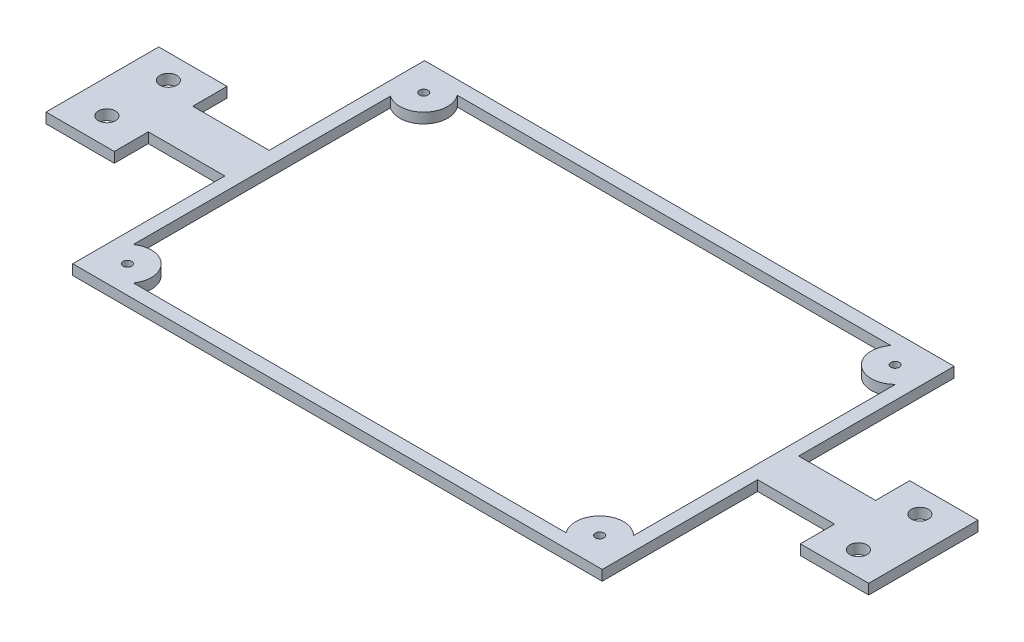
ISO-10303-21;
HEADER;
FILE_DESCRIPTION(('STEP AP214'),'2;1');
FILE_NAME('part.step','',(''),(''),'','','');
FILE_SCHEMA(('AUTOMOTIVE_DESIGN { 1 0 10303 214 1 1 1 1 }'));
ENDSEC;
DATA;
#1=APPLICATION_CONTEXT('core data for automotive mechanical design processes');
#2=APPLICATION_PROTOCOL_DEFINITION('international standard','automotive_design',2000,#1);
#3=PRODUCT_CONTEXT('',#1,'mechanical');
#4=PRODUCT('Part','Part','',(#3));
#5=PRODUCT_RELATED_PRODUCT_CATEGORY('part','',(#4));
#6=PRODUCT_DEFINITION_FORMATION('','',#4);
#7=PRODUCT_DEFINITION_CONTEXT('part definition',#1,'design');
#8=PRODUCT_DEFINITION('design','',#6,#7);
#9=PRODUCT_DEFINITION_SHAPE('','',#8);
#10=(LENGTH_UNIT() NAMED_UNIT(*) SI_UNIT(.MILLI.,.METRE.));
#11=(NAMED_UNIT(*) PLANE_ANGLE_UNIT() SI_UNIT($,.RADIAN.));
#12=(NAMED_UNIT(*) SI_UNIT($,.STERADIAN.) SOLID_ANGLE_UNIT());
#13=UNCERTAINTY_MEASURE_WITH_UNIT(LENGTH_MEASURE(1.E-05),#10,'distance_accuracy_value','');
#14=(GEOMETRIC_REPRESENTATION_CONTEXT(3) GLOBAL_UNCERTAINTY_ASSIGNED_CONTEXT((#13)) GLOBAL_UNIT_ASSIGNED_CONTEXT((#10,
#11,#12)) REPRESENTATION_CONTEXT('',''));
#15=CARTESIAN_POINT('',(0.,0.,0.));
#16=DIRECTION('',(0.,0.,1.));
#17=DIRECTION('',(1.,0.,0.));
#18=AXIS2_PLACEMENT_3D('',#15,#16,#17);
#19=CARTESIAN_POINT('',(155.,3.,0.));
#20=DIRECTION('',(-1.,0.,0.));
#21=DIRECTION('',(0.,0.,1.));
#22=AXIS2_PLACEMENT_3D('',#19,#20,#21);
#23=PLANE('',#22);
#24=DIRECTION('',(0.,1.,0.));
#25=VECTOR('',#24,1.);
#26=CARTESIAN_POINT('',(155.,3.,-57.5));
#27=LINE('',#26,#25);
#28=CARTESIAN_POINT('',(155.,0.,-57.5));
#29=VERTEX_POINT('',#28);
#30=CARTESIAN_POINT('',(155.,3.,-57.5));
#31=VERTEX_POINT('',#30);
#32=EDGE_CURVE('E378',#29,#31,#27,.T.);
#33=ORIENTED_EDGE('',*,*,#32,.F.);
#34=DIRECTION('',(0.,0.,-1.));
#35=VECTOR('',#34,1.);
#36=CARTESIAN_POINT('',(155.,0.,0.));
#37=LINE('',#36,#35);
#38=CARTESIAN_POINT('',(155.,0.,-103.));
#39=VERTEX_POINT('',#38);
#40=EDGE_CURVE('E453',#29,#39,#37,.T.);
#41=ORIENTED_EDGE('',*,*,#40,.T.);
#42=DIRECTION('',(0.,-1.,0.));
#43=VECTOR('',#42,1.);
#44=CARTESIAN_POINT('',(155.,3.,-103.));
#45=LINE('',#44,#43);
#46=CARTESIAN_POINT('',(155.,3.,-103.));
#47=VERTEX_POINT('',#46);
#48=EDGE_CURVE('E460',#47,#39,#45,.T.);
#49=ORIENTED_EDGE('',*,*,#48,.F.);
#50=DIRECTION('',(0.,0.,-1.));
#51=VECTOR('',#50,1.);
#52=CARTESIAN_POINT('',(155.,3.,0.));
#53=LINE('',#52,#51);
#54=EDGE_CURVE('E441',#31,#47,#53,.T.);
#55=ORIENTED_EDGE('',*,*,#54,.F.);
#56=EDGE_LOOP('',(#33,#41,#49,#55));
#57=FACE_BOUND('',#56,.T.);
#58=ADVANCED_FACE('F32',(#57),#23,.F.);
#59=DIRECTION('',(0.,-1.,0.));
#60=VECTOR('',#59,1.);
#61=CARTESIAN_POINT('',(155.,3.,-45.5));
#62=LINE('',#61,#60);
#63=CARTESIAN_POINT('',(155.,3.,-45.5));
#64=VERTEX_POINT('',#63);
#65=CARTESIAN_POINT('',(155.,0.,-45.5));
#66=VERTEX_POINT('',#65);
#67=EDGE_CURVE('E389',#64,#66,#62,.T.);
#68=ORIENTED_EDGE('',*,*,#67,.F.);
#69=CARTESIAN_POINT('',(155.,3.,0.));
#70=VERTEX_POINT('',#69);
#71=EDGE_CURVE('E442',#70,#64,#53,.T.);
#72=ORIENTED_EDGE('',*,*,#71,.F.);
#73=DIRECTION('',(0.,-1.,0.));
#74=VECTOR('',#73,1.);
#75=CARTESIAN_POINT('',(155.,3.,0.));
#76=LINE('',#75,#74);
#77=CARTESIAN_POINT('',(155.,0.,0.));
#78=VERTEX_POINT('',#77);
#79=EDGE_CURVE('E463',#70,#78,#76,.T.);
#80=ORIENTED_EDGE('',*,*,#79,.T.);
#81=EDGE_CURVE('E454',#78,#66,#37,.T.);
#82=ORIENTED_EDGE('',*,*,#81,.T.);
#83=EDGE_LOOP('',(#68,#72,#80,#82));
#84=FACE_BOUND('',#83,.T.);
#85=ADVANCED_FACE('F510',(#84),#23,.F.);
#86=CARTESIAN_POINT('',(0.,3.,0.));
#87=DIRECTION('',(1.,0.,0.));
#88=DIRECTION('',(0.,0.,-1.));
#89=AXIS2_PLACEMENT_3D('',#86,#87,#88);
#90=PLANE('',#89);
#91=DIRECTION('',(0.,-1.,0.));
#92=VECTOR('',#91,1.);
#93=CARTESIAN_POINT('',(0.,0.,-57.5));
#94=LINE('',#93,#92);
#95=CARTESIAN_POINT('',(0.,3.,-57.5));
#96=VERTEX_POINT('',#95);
#97=CARTESIAN_POINT('',(0.,0.,-57.5));
#98=VERTEX_POINT('',#97);
#99=EDGE_CURVE('E408',#96,#98,#94,.T.);
#100=ORIENTED_EDGE('',*,*,#99,.F.);
#101=DIRECTION('',(0.,0.,1.));
#102=VECTOR('',#101,1.);
#103=CARTESIAN_POINT('',(0.,3.,0.));
#104=LINE('',#103,#102);
#105=CARTESIAN_POINT('',(0.,3.,-103.));
#106=VERTEX_POINT('',#105);
#107=EDGE_CURVE('E435',#106,#96,#104,.T.);
#108=ORIENTED_EDGE('',*,*,#107,.F.);
#109=DIRECTION('',(0.,-1.,0.));
#110=VECTOR('',#109,1.);
#111=CARTESIAN_POINT('',(0.,3.,-103.));
#112=LINE('',#111,#110);
#113=CARTESIAN_POINT('',(0.,0.,-103.));
#114=VERTEX_POINT('',#113);
#115=EDGE_CURVE('E447',#106,#114,#112,.T.);
#116=ORIENTED_EDGE('',*,*,#115,.T.);
#117=DIRECTION('',(0.,0.,1.));
#118=VECTOR('',#117,1.);
#119=CARTESIAN_POINT('',(0.,0.,0.));
#120=LINE('',#119,#118);
#121=EDGE_CURVE('E448',#114,#98,#120,.T.);
#122=ORIENTED_EDGE('',*,*,#121,.T.);
#123=EDGE_LOOP('',(#100,#108,#116,#122));
#124=FACE_BOUND('',#123,.T.);
#125=ADVANCED_FACE('F34',(#124),#90,.F.);
#126=DIRECTION('',(0.,1.,0.));
#127=VECTOR('',#126,1.);
#128=CARTESIAN_POINT('',(0.,0.,-44.5));
#129=LINE('',#128,#127);
#130=CARTESIAN_POINT('',(0.,0.,-44.5));
#131=VERTEX_POINT('',#130);
#132=CARTESIAN_POINT('',(0.,3.,-44.5));
#133=VERTEX_POINT('',#132);
#134=EDGE_CURVE('E411',#131,#133,#129,.T.);
#135=ORIENTED_EDGE('',*,*,#134,.F.);
#136=CARTESIAN_POINT('',(0.,0.,0.));
#137=VERTEX_POINT('',#136);
#138=EDGE_CURVE('E227',#131,#137,#120,.T.);
#139=ORIENTED_EDGE('',*,*,#138,.T.);
#140=DIRECTION('',(0.,-1.,0.));
#141=VECTOR('',#140,1.);
#142=CARTESIAN_POINT('',(0.,3.,0.));
#143=LINE('',#142,#141);
#144=CARTESIAN_POINT('',(0.,3.,0.));
#145=VERTEX_POINT('',#144);
#146=EDGE_CURVE('E466',#145,#137,#143,.T.);
#147=ORIENTED_EDGE('',*,*,#146,.F.);
#148=EDGE_CURVE('E439',#133,#145,#104,.T.);
#149=ORIENTED_EDGE('',*,*,#148,.F.);
#150=EDGE_LOOP('',(#135,#139,#147,#149));
#151=FACE_BOUND('',#150,.T.);
#152=ADVANCED_FACE('F547',(#151),#90,.F.);
#153=CARTESIAN_POINT('',(0.,3.,0.));
#154=DIRECTION('',(0.,-1.,0.));
#155=DIRECTION('',(0.,0.,-1.));
#156=AXIS2_PLACEMENT_3D('',#153,#154,#155);
#157=PLANE('',#156);
#158=DIRECTION('',(1.,0.,0.));
#159=VECTOR('',#158,1.);
#160=CARTESIAN_POINT('',(-22.5,3.,-57.5));
#161=LINE('',#160,#159);
#162=CARTESIAN_POINT('',(-22.3784310728865,3.,-57.5));
#163=VERTEX_POINT('',#162);
#164=EDGE_CURVE('E414',#163,#96,#161,.T.);
#165=ORIENTED_EDGE('',*,*,#164,.F.);
#166=DIRECTION('',(0.,0.,-1.));
#167=VECTOR('',#166,1.);
#168=CARTESIAN_POINT('',(-22.3784310728865,3.,-67.5503902211051));
#169=LINE('',#168,#167);
#170=CARTESIAN_POINT('',(-22.3784310728865,3.,-67.5503902211051));
#171=VERTEX_POINT('',#170);
#172=EDGE_CURVE('E298',#163,#171,#169,.T.);
#173=ORIENTED_EDGE('',*,*,#172,.T.);
#174=DIRECTION('',(-1.,0.,0.));
#175=VECTOR('',#174,1.);
#176=CARTESIAN_POINT('',(-22.3784310728865,3.,-67.5503902211051));
#177=LINE('',#176,#175);
#178=CARTESIAN_POINT('',(-42.3784310728865,3.,-67.5503902211051));
#179=VERTEX_POINT('',#178);
#180=EDGE_CURVE('E318',#171,#179,#177,.T.);
#181=ORIENTED_EDGE('',*,*,#180,.T.);
#182=DIRECTION('',(0.,0.,1.));
#183=VECTOR('',#182,1.);
#184=CARTESIAN_POINT('',(-42.3784310728865,3.,-67.5503902211051));
#185=LINE('',#184,#183);
#186=CARTESIAN_POINT('',(-42.3784310728865,3.,-34.5503902211051));
#187=VERTEX_POINT('',#186);
#188=EDGE_CURVE('E321',#179,#187,#185,.T.);
#189=ORIENTED_EDGE('',*,*,#188,.T.);
#190=DIRECTION('',(1.,0.,0.));
#191=VECTOR('',#190,1.);
#192=CARTESIAN_POINT('',(-22.3784310728865,3.,-34.5503902211051));
#193=LINE('',#192,#191);
#194=CARTESIAN_POINT('',(-22.3784310728865,3.,-34.5503902211051));
#195=VERTEX_POINT('',#194);
#196=EDGE_CURVE('E324',#187,#195,#193,.T.);
#197=ORIENTED_EDGE('',*,*,#196,.T.);
#198=CARTESIAN_POINT('',(-22.3784310728865,3.,-44.5));
#199=VERTEX_POINT('',#198);
#200=EDGE_CURVE('E315',#195,#199,#169,.T.);
#201=ORIENTED_EDGE('',*,*,#200,.T.);
#202=DIRECTION('',(1.,0.,0.));
#203=VECTOR('',#202,1.);
#204=CARTESIAN_POINT('',(-22.5,3.,-44.5));
#205=LINE('',#204,#203);
#206=EDGE_CURVE('E416',#199,#133,#205,.T.);
#207=ORIENTED_EDGE('',*,*,#206,.T.);
#208=ORIENTED_EDGE('',*,*,#148,.T.);
#209=DIRECTION('',(1.,0.,0.));
#210=VECTOR('',#209,1.);
#211=CARTESIAN_POINT('',(0.,3.,0.));
#212=LINE('',#211,#210);
#213=EDGE_CURVE('E438',#145,#70,#212,.T.);
#214=ORIENTED_EDGE('',*,*,#213,.T.);
#215=ORIENTED_EDGE('',*,*,#71,.T.);
#216=DIRECTION('',(-1.,0.,0.));
#217=VECTOR('',#216,1.);
#218=CARTESIAN_POINT('',(177.5,3.,-45.5));
#219=LINE('',#218,#217);
#220=CARTESIAN_POINT('',(177.5,3.,-45.5));
#221=VERTEX_POINT('',#220);
#222=EDGE_CURVE('E402',#221,#64,#219,.T.);
#223=ORIENTED_EDGE('',*,*,#222,.F.);
#224=DIRECTION('',(0.,0.,1.));
#225=VECTOR('',#224,1.);
#226=CARTESIAN_POINT('',(177.5,3.,-67.5));
#227=LINE('',#226,#225);
#228=CARTESIAN_POINT('',(177.5,3.,-35.5));
#229=VERTEX_POINT('',#228);
#230=EDGE_CURVE('E347',#221,#229,#227,.T.);
#231=ORIENTED_EDGE('',*,*,#230,.T.);
#232=DIRECTION('',(1.,0.,0.));
#233=VECTOR('',#232,1.);
#234=CARTESIAN_POINT('',(177.5,3.,-35.5));
#235=LINE('',#234,#233);
#236=CARTESIAN_POINT('',(197.5,3.,-35.5));
#237=VERTEX_POINT('',#236);
#238=EDGE_CURVE('E367',#229,#237,#235,.T.);
#239=ORIENTED_EDGE('',*,*,#238,.T.);
#240=DIRECTION('',(0.,0.,-1.));
#241=VECTOR('',#240,1.);
#242=CARTESIAN_POINT('',(197.5,3.,-67.5));
#243=LINE('',#242,#241);
#244=CARTESIAN_POINT('',(197.5,3.,-67.5));
#245=VERTEX_POINT('',#244);
#246=EDGE_CURVE('E370',#237,#245,#243,.T.);
#247=ORIENTED_EDGE('',*,*,#246,.T.);
#248=DIRECTION('',(-1.,0.,0.));
#249=VECTOR('',#248,1.);
#250=CARTESIAN_POINT('',(177.5,3.,-67.5));
#251=LINE('',#250,#249);
#252=CARTESIAN_POINT('',(177.5,3.,-67.5));
#253=VERTEX_POINT('',#252);
#254=EDGE_CURVE('E373',#245,#253,#251,.T.);
#255=ORIENTED_EDGE('',*,*,#254,.T.);
#256=CARTESIAN_POINT('',(177.5,3.,-57.5));
#257=VERTEX_POINT('',#256);
#258=EDGE_CURVE('E364',#253,#257,#227,.T.);
#259=ORIENTED_EDGE('',*,*,#258,.T.);
#260=DIRECTION('',(-1.,0.,0.));
#261=VECTOR('',#260,1.);
#262=CARTESIAN_POINT('',(177.5,3.,-57.5));
#263=LINE('',#262,#261);
#264=EDGE_CURVE('E405',#257,#31,#263,.T.);
#265=ORIENTED_EDGE('',*,*,#264,.T.);
#266=ORIENTED_EDGE('',*,*,#54,.T.);
#267=DIRECTION('',(-1.,0.,0.));
#268=VECTOR('',#267,1.);
#269=CARTESIAN_POINT('',(0.,3.,-103.));
#270=LINE('',#269,#268);
#271=EDGE_CURVE('E445',#47,#106,#270,.T.);
#272=ORIENTED_EDGE('',*,*,#271,.T.);
#273=ORIENTED_EDGE('',*,*,#107,.T.);
#274=EDGE_LOOP('',(#165,#173,#181,#189,#197,#201,#207,#208,#214,#215,#223,#231,#239,#247,#255,
#259,#265,#266,#272,#273));
#275=FACE_BOUND('',#274,.T.);
#276=DIRECTION('',(-1.,0.,0.));
#277=VECTOR('',#276,1.);
#278=CARTESIAN_POINT('',(4.,3.,-99.));
#279=LINE('',#278,#277);
#280=CARTESIAN_POINT('',(140.437851134678,3.,-99.));
#281=VERTEX_POINT('',#280);
#282=CARTESIAN_POINT('',(13.5621488653217,3.,-99.));
#283=VERTEX_POINT('',#282);
#284=EDGE_CURVE('E215',#281,#283,#279,.T.);
#285=ORIENTED_EDGE('',*,*,#284,.F.);
#286=CARTESIAN_POINT('',(146.,3.,-94.75));
#287=DIRECTION('',(0.,1.,0.));
#288=DIRECTION('',(0.,0.,1.));
#289=AXIS2_PLACEMENT_3D('',#286,#287,#288);
#290=CIRCLE('',#289,7.00000000000002);
#291=CARTESIAN_POINT('',(151.,3.,-89.8510205144336));
#292=VERTEX_POINT('',#291);
#293=EDGE_CURVE('E220',#281,#292,#290,.T.);
#294=ORIENTED_EDGE('',*,*,#293,.T.);
#295=DIRECTION('',(0.,0.,-1.));
#296=VECTOR('',#295,1.);
#297=CARTESIAN_POINT('',(151.,3.,-4.));
#298=LINE('',#297,#296);
#299=CARTESIAN_POINT('',(151.,3.,-13.1489794855664));
#300=VERTEX_POINT('',#299);
#301=EDGE_CURVE('E52',#300,#292,#298,.T.);
#302=ORIENTED_EDGE('',*,*,#301,.F.);
#303=CARTESIAN_POINT('',(146.,3.,-8.25));
#304=DIRECTION('',(0.,1.,0.));
#305=DIRECTION('',(0.,0.,1.));
#306=AXIS2_PLACEMENT_3D('',#303,#304,#305);
#307=CIRCLE('',#306,7.00000000000001);
#308=CARTESIAN_POINT('',(140.437851134678,3.,-4.));
#309=VERTEX_POINT('',#308);
#310=EDGE_CURVE('E262',#300,#309,#307,.T.);
#311=ORIENTED_EDGE('',*,*,#310,.T.);
#312=DIRECTION('',(1.,0.,0.));
#313=VECTOR('',#312,1.);
#314=CARTESIAN_POINT('',(4.,3.,-4.));
#315=LINE('',#314,#313);
#316=CARTESIAN_POINT('',(13.744562646538,3.,-4.));
#317=VERTEX_POINT('',#316);
#318=EDGE_CURVE('E425',#317,#309,#315,.T.);
#319=ORIENTED_EDGE('',*,*,#318,.F.);
#320=CARTESIAN_POINT('',(8.,3.,-8.));
#321=DIRECTION('',(0.,1.,0.));
#322=DIRECTION('',(0.,0.,1.));
#323=AXIS2_PLACEMENT_3D('',#320,#321,#322);
#324=CIRCLE('',#323,7.);
#325=CARTESIAN_POINT('',(4.,3.,-13.744562646538));
#326=VERTEX_POINT('',#325);
#327=EDGE_CURVE('E277',#317,#326,#324,.T.);
#328=ORIENTED_EDGE('',*,*,#327,.T.);
#329=DIRECTION('',(0.,0.,1.));
#330=VECTOR('',#329,1.);
#331=CARTESIAN_POINT('',(4.,3.,-4.));
#332=LINE('',#331,#330);
#333=CARTESIAN_POINT('',(4.,3.,-89.005437353462));
#334=VERTEX_POINT('',#333);
#335=EDGE_CURVE('E423',#334,#326,#332,.T.);
#336=ORIENTED_EDGE('',*,*,#335,.F.);
#337=CARTESIAN_POINT('',(8.,3.,-94.75));
#338=DIRECTION('',(0.,1.,0.));
#339=DIRECTION('',(0.,0.,1.));
#340=AXIS2_PLACEMENT_3D('',#337,#338,#339);
#341=CIRCLE('',#340,7.);
#342=EDGE_CURVE('E223',#334,#283,#341,.T.);
#343=ORIENTED_EDGE('',*,*,#342,.T.);
#344=EDGE_LOOP('',(#285,#294,#302,#311,#319,#328,#336,#343));
#345=FACE_BOUND('',#344,.T.);
#346=CARTESIAN_POINT('',(187.5,3.,-60.5));
#347=DIRECTION('',(0.,1.,0.));
#348=DIRECTION('',(0.,0.,1.));
#349=AXIS2_PLACEMENT_3D('',#346,#347,#348);
#350=CIRCLE('',#349,2.5);
#351=CARTESIAN_POINT('',(187.5,3.,-58.));
#352=VERTEX_POINT('',#351);
#353=EDGE_CURVE('E337',#352,#352,#350,.T.);
#354=ORIENTED_EDGE('',*,*,#353,.F.);
#355=EDGE_LOOP('',(#354));
#356=FACE_BOUND('',#355,.T.);
#357=CARTESIAN_POINT('',(187.5,3.,-42.5));
#358=DIRECTION('',(0.,1.,0.));
#359=DIRECTION('',(0.,0.,1.));
#360=AXIS2_PLACEMENT_3D('',#357,#358,#359);
#361=CIRCLE('',#360,2.5);
#362=CARTESIAN_POINT('',(187.5,3.,-40.));
#363=VERTEX_POINT('',#362);
#364=EDGE_CURVE('E341',#363,#363,#361,.T.);
#365=ORIENTED_EDGE('',*,*,#364,.F.);
#366=EDGE_LOOP('',(#365));
#367=FACE_BOUND('',#366,.T.);
#368=CARTESIAN_POINT('',(-32.5,3.,-60.5));
#369=DIRECTION('',(0.,1.,0.));
#370=DIRECTION('',(0.,0.,1.));
#371=AXIS2_PLACEMENT_3D('',#368,#369,#370);
#372=CIRCLE('',#371,2.5);
#373=CARTESIAN_POINT('',(-32.5,3.,-58.));
#374=VERTEX_POINT('',#373);
#375=EDGE_CURVE('E288',#374,#374,#372,.T.);
#376=ORIENTED_EDGE('',*,*,#375,.F.);
#377=EDGE_LOOP('',(#376));
#378=FACE_BOUND('',#377,.T.);
#379=CARTESIAN_POINT('',(-32.5,3.,-42.5));
#380=DIRECTION('',(0.,1.,0.));
#381=DIRECTION('',(0.,0.,1.));
#382=AXIS2_PLACEMENT_3D('',#379,#380,#381);
#383=CIRCLE('',#382,2.5);
#384=CARTESIAN_POINT('',(-32.5,3.,-40.));
#385=VERTEX_POINT('',#384);
#386=EDGE_CURVE('E292',#385,#385,#383,.T.);
#387=ORIENTED_EDGE('',*,*,#386,.F.);
#388=EDGE_LOOP('',(#387));
#389=FACE_BOUND('',#388,.T.);
#390=CARTESIAN_POINT('',(8.,3.,-8.));
#391=DIRECTION('',(0.,1.,0.));
#392=DIRECTION('',(0.,0.,1.));
#393=AXIS2_PLACEMENT_3D('',#390,#391,#392);
#394=CIRCLE('',#393,1.25);
#395=CARTESIAN_POINT('',(8.,3.,-6.75));
#396=VERTEX_POINT('',#395);
#397=EDGE_CURVE('E273',#396,#396,#394,.T.);
#398=ORIENTED_EDGE('',*,*,#397,.F.);
#399=EDGE_LOOP('',(#398));
#400=FACE_BOUND('',#399,.T.);
#401=CARTESIAN_POINT('',(146.,3.,-8.25));
#402=DIRECTION('',(0.,1.,0.));
#403=DIRECTION('',(0.,0.,1.));
#404=AXIS2_PLACEMENT_3D('',#401,#402,#403);
#405=CIRCLE('',#404,1.25000000000001);
#406=CARTESIAN_POINT('',(146.,3.,-6.99999999999999));
#407=VERTEX_POINT('',#406);
#408=EDGE_CURVE('E258',#407,#407,#405,.T.);
#409=ORIENTED_EDGE('',*,*,#408,.F.);
#410=EDGE_LOOP('',(#409));
#411=FACE_BOUND('',#410,.T.);
#412=CARTESIAN_POINT('',(8.,3.,-94.75));
#413=DIRECTION('',(0.,1.,0.));
#414=DIRECTION('',(0.,0.,1.));
#415=AXIS2_PLACEMENT_3D('',#412,#413,#414);
#416=CIRCLE('',#415,1.25);
#417=CARTESIAN_POINT('',(8.,3.,-93.5));
#418=VERTEX_POINT('',#417);
#419=EDGE_CURVE('E245',#418,#418,#416,.T.);
#420=ORIENTED_EDGE('',*,*,#419,.F.);
#421=EDGE_LOOP('',(#420));
#422=FACE_BOUND('',#421,.T.);
#423=CARTESIAN_POINT('',(146.,3.,-94.75));
#424=DIRECTION('',(0.,1.,0.));
#425=DIRECTION('',(0.,0.,1.));
#426=AXIS2_PLACEMENT_3D('',#423,#424,#425);
#427=CIRCLE('',#426,1.25000000000001);
#428=CARTESIAN_POINT('',(146.,3.,-93.5));
#429=VERTEX_POINT('',#428);
#430=EDGE_CURVE('E240',#429,#429,#427,.T.);
#431=ORIENTED_EDGE('',*,*,#430,.F.);
#432=EDGE_LOOP('',(#431));
#433=FACE_BOUND('',#432,.T.);
#434=ADVANCED_FACE('F217',(#275,#345,#356,#367,#378,#389,#400,#411,#422,#433),#157,.F.);
#435=CARTESIAN_POINT('',(0.,0.,0.));
#436=DIRECTION('',(0.,-1.,0.));
#437=DIRECTION('',(0.,0.,-1.));
#438=AXIS2_PLACEMENT_3D('',#435,#436,#437);
#439=PLANE('',#438);
#440=DIRECTION('',(0.,0.,-1.));
#441=VECTOR('',#440,1.);
#442=CARTESIAN_POINT('',(151.,0.,-4.));
#443=LINE('',#442,#441);
#444=CARTESIAN_POINT('',(151.,0.,-13.1489794855664));
#445=VERTEX_POINT('',#444);
#446=CARTESIAN_POINT('',(151.,0.,-89.8510205144336));
#447=VERTEX_POINT('',#446);
#448=EDGE_CURVE('E432',#445,#447,#443,.T.);
#449=ORIENTED_EDGE('',*,*,#448,.T.);
#450=CARTESIAN_POINT('',(146.,0.,-94.75));
#451=DIRECTION('',(0.,1.,0.));
#452=DIRECTION('',(0.,0.,1.));
#453=AXIS2_PLACEMENT_3D('',#450,#451,#452);
#454=CIRCLE('',#453,7.00000000000002);
#455=CARTESIAN_POINT('',(140.437851134678,0.,-99.));
#456=VERTEX_POINT('',#455);
#457=EDGE_CURVE('E235',#456,#447,#454,.T.);
#458=ORIENTED_EDGE('',*,*,#457,.F.);
#459=DIRECTION('',(-1.,0.,0.));
#460=VECTOR('',#459,1.);
#461=CARTESIAN_POINT('',(4.,0.,-99.));
#462=LINE('',#461,#460);
#463=CARTESIAN_POINT('',(13.5621488653217,0.,-99.));
#464=VERTEX_POINT('',#463);
#465=EDGE_CURVE('E230',#456,#464,#462,.T.);
#466=ORIENTED_EDGE('',*,*,#465,.T.);
#467=CARTESIAN_POINT('',(8.,0.,-94.75));
#468=DIRECTION('',(0.,1.,0.));
#469=DIRECTION('',(0.,0.,1.));
#470=AXIS2_PLACEMENT_3D('',#467,#468,#469);
#471=CIRCLE('',#470,7.);
#472=CARTESIAN_POINT('',(4.,0.,-89.005437353462));
#473=VERTEX_POINT('',#472);
#474=EDGE_CURVE('E251',#473,#464,#471,.T.);
#475=ORIENTED_EDGE('',*,*,#474,.F.);
#476=DIRECTION('',(0.,0.,1.));
#477=VECTOR('',#476,1.);
#478=CARTESIAN_POINT('',(4.,0.,-4.));
#479=LINE('',#478,#477);
#480=CARTESIAN_POINT('',(4.,0.,-13.744562646538));
#481=VERTEX_POINT('',#480);
#482=EDGE_CURVE('E422',#473,#481,#479,.T.);
#483=ORIENTED_EDGE('',*,*,#482,.T.);
#484=CARTESIAN_POINT('',(8.,0.,-8.));
#485=DIRECTION('',(0.,1.,0.));
#486=DIRECTION('',(0.,0.,1.));
#487=AXIS2_PLACEMENT_3D('',#484,#485,#486);
#488=CIRCLE('',#487,7.);
#489=CARTESIAN_POINT('',(13.744562646538,0.,-4.));
#490=VERTEX_POINT('',#489);
#491=EDGE_CURVE('E280',#490,#481,#488,.T.);
#492=ORIENTED_EDGE('',*,*,#491,.F.);
#493=DIRECTION('',(1.,0.,0.));
#494=VECTOR('',#493,1.);
#495=CARTESIAN_POINT('',(4.,0.,-4.));
#496=LINE('',#495,#494);
#497=CARTESIAN_POINT('',(140.437851134678,0.,-4.));
#498=VERTEX_POINT('',#497);
#499=EDGE_CURVE('E429',#490,#498,#496,.T.);
#500=ORIENTED_EDGE('',*,*,#499,.T.);
#501=CARTESIAN_POINT('',(146.,0.,-8.25));
#502=DIRECTION('',(0.,1.,0.));
#503=DIRECTION('',(0.,0.,1.));
#504=AXIS2_PLACEMENT_3D('',#501,#502,#503);
#505=CIRCLE('',#504,7.00000000000001);
#506=EDGE_CURVE('E265',#445,#498,#505,.T.);
#507=ORIENTED_EDGE('',*,*,#506,.F.);
#508=EDGE_LOOP('',(#449,#458,#466,#475,#483,#492,#500,#507));
#509=FACE_BOUND('',#508,.T.);
#510=DIRECTION('',(1.,0.,0.));
#511=VECTOR('',#510,1.);
#512=CARTESIAN_POINT('',(-22.5,0.,-44.5));
#513=LINE('',#512,#511);
#514=CARTESIAN_POINT('',(-22.3784310728865,0.,-44.5));
#515=VERTEX_POINT('',#514);
#516=EDGE_CURVE('E418',#515,#131,#513,.T.);
#517=ORIENTED_EDGE('',*,*,#516,.F.);
#518=DIRECTION('',(0.,0.,-1.));
#519=VECTOR('',#518,1.);
#520=CARTESIAN_POINT('',(-22.3784310728865,0.,-67.5503902211051));
#521=LINE('',#520,#519);
#522=CARTESIAN_POINT('',(-22.3784310728865,0.,-34.5503902211051));
#523=VERTEX_POINT('',#522);
#524=EDGE_CURVE('E301',#523,#515,#521,.T.);
#525=ORIENTED_EDGE('',*,*,#524,.F.);
#526=DIRECTION('',(1.,0.,0.));
#527=VECTOR('',#526,1.);
#528=CARTESIAN_POINT('',(-22.3784310728865,0.,-34.5503902211051));
#529=LINE('',#528,#527);
#530=CARTESIAN_POINT('',(-42.3784310728865,0.,-34.5503902211051));
#531=VERTEX_POINT('',#530);
#532=EDGE_CURVE('E311',#531,#523,#529,.T.);
#533=ORIENTED_EDGE('',*,*,#532,.F.);
#534=DIRECTION('',(0.,0.,1.));
#535=VECTOR('',#534,1.);
#536=CARTESIAN_POINT('',(-42.3784310728865,0.,-67.5503902211051));
#537=LINE('',#536,#535);
#538=CARTESIAN_POINT('',(-42.3784310728865,0.,-67.5503902211051));
#539=VERTEX_POINT('',#538);
#540=EDGE_CURVE('E308',#539,#531,#537,.T.);
#541=ORIENTED_EDGE('',*,*,#540,.F.);
#542=DIRECTION('',(-1.,0.,0.));
#543=VECTOR('',#542,1.);
#544=CARTESIAN_POINT('',(-22.3784310728865,0.,-67.5503902211051));
#545=LINE('',#544,#543);
#546=CARTESIAN_POINT('',(-22.3784310728865,0.,-67.5503902211051));
#547=VERTEX_POINT('',#546);
#548=EDGE_CURVE('E304',#547,#539,#545,.T.);
#549=ORIENTED_EDGE('',*,*,#548,.F.);
#550=CARTESIAN_POINT('',(-22.3784310728865,0.,-57.5));
#551=VERTEX_POINT('',#550);
#552=EDGE_CURVE('E305',#551,#547,#521,.T.);
#553=ORIENTED_EDGE('',*,*,#552,.F.);
#554=DIRECTION('',(1.,0.,0.));
#555=VECTOR('',#554,1.);
#556=CARTESIAN_POINT('',(-22.5,0.,-57.5));
#557=LINE('',#556,#555);
#558=EDGE_CURVE('E420',#551,#98,#557,.T.);
#559=ORIENTED_EDGE('',*,*,#558,.T.);
#560=ORIENTED_EDGE('',*,*,#121,.F.);
#561=DIRECTION('',(-1.,0.,0.));
#562=VECTOR('',#561,1.);
#563=CARTESIAN_POINT('',(0.,0.,-103.));
#564=LINE('',#563,#562);
#565=EDGE_CURVE('E456',#39,#114,#564,.T.);
#566=ORIENTED_EDGE('',*,*,#565,.F.);
#567=ORIENTED_EDGE('',*,*,#40,.F.);
#568=DIRECTION('',(-1.,0.,0.));
#569=VECTOR('',#568,1.);
#570=CARTESIAN_POINT('',(177.5,0.,-57.5));
#571=LINE('',#570,#569);
#572=CARTESIAN_POINT('',(177.5,0.,-57.5));
#573=VERTEX_POINT('',#572);
#574=EDGE_CURVE('E392',#573,#29,#571,.T.);
#575=ORIENTED_EDGE('',*,*,#574,.F.);
#576=DIRECTION('',(0.,0.,1.));
#577=VECTOR('',#576,1.);
#578=CARTESIAN_POINT('',(177.5,0.,-67.5));
#579=LINE('',#578,#577);
#580=CARTESIAN_POINT('',(177.5,0.,-67.5));
#581=VERTEX_POINT('',#580);
#582=EDGE_CURVE('E350',#581,#573,#579,.T.);
#583=ORIENTED_EDGE('',*,*,#582,.F.);
#584=DIRECTION('',(-1.,0.,0.));
#585=VECTOR('',#584,1.);
#586=CARTESIAN_POINT('',(177.5,0.,-67.5));
#587=LINE('',#586,#585);
#588=CARTESIAN_POINT('',(197.5,0.,-67.5));
#589=VERTEX_POINT('',#588);
#590=EDGE_CURVE('E360',#589,#581,#587,.T.);
#591=ORIENTED_EDGE('',*,*,#590,.F.);
#592=DIRECTION('',(0.,0.,-1.));
#593=VECTOR('',#592,1.);
#594=CARTESIAN_POINT('',(197.5,0.,-67.5));
#595=LINE('',#594,#593);
#596=CARTESIAN_POINT('',(197.5,0.,-35.5));
#597=VERTEX_POINT('',#596);
#598=EDGE_CURVE('E357',#597,#589,#595,.T.);
#599=ORIENTED_EDGE('',*,*,#598,.F.);
#600=DIRECTION('',(1.,0.,0.));
#601=VECTOR('',#600,1.);
#602=CARTESIAN_POINT('',(177.5,0.,-35.5));
#603=LINE('',#602,#601);
#604=CARTESIAN_POINT('',(177.5,0.,-35.5));
#605=VERTEX_POINT('',#604);
#606=EDGE_CURVE('E353',#605,#597,#603,.T.);
#607=ORIENTED_EDGE('',*,*,#606,.F.);
#608=CARTESIAN_POINT('',(177.5,0.,-45.5));
#609=VERTEX_POINT('',#608);
#610=EDGE_CURVE('E354',#609,#605,#579,.T.);
#611=ORIENTED_EDGE('',*,*,#610,.F.);
#612=DIRECTION('',(-1.,0.,0.));
#613=VECTOR('',#612,1.);
#614=CARTESIAN_POINT('',(177.5,0.,-45.5));
#615=LINE('',#614,#613);
#616=EDGE_CURVE('E399',#609,#66,#615,.T.);
#617=ORIENTED_EDGE('',*,*,#616,.T.);
#618=ORIENTED_EDGE('',*,*,#81,.F.);
#619=DIRECTION('',(1.,0.,0.));
#620=VECTOR('',#619,1.);
#621=CARTESIAN_POINT('',(0.,0.,0.));
#622=LINE('',#621,#620);
#623=EDGE_CURVE('E451',#137,#78,#622,.T.);
#624=ORIENTED_EDGE('',*,*,#623,.F.);
#625=ORIENTED_EDGE('',*,*,#138,.F.);
#626=EDGE_LOOP('',(#517,#525,#533,#541,#549,#553,#559,#560,#566,#567,#575,#583,#591,#599,#607,
#611,#617,#618,#624,#625));
#627=FACE_BOUND('',#626,.T.);
#628=CARTESIAN_POINT('',(187.5,0.,-60.5));
#629=DIRECTION('',(0.,1.,0.));
#630=DIRECTION('',(0.,0.,1.));
#631=AXIS2_PLACEMENT_3D('',#628,#629,#630);
#632=CIRCLE('',#631,2.5);
#633=CARTESIAN_POINT('',(187.5,0.,-58.));
#634=VERTEX_POINT('',#633);
#635=EDGE_CURVE('E338',#634,#634,#632,.T.);
#636=ORIENTED_EDGE('',*,*,#635,.T.);
#637=EDGE_LOOP('',(#636));
#638=FACE_BOUND('',#637,.T.);
#639=CARTESIAN_POINT('',(187.5,0.,-42.5));
#640=DIRECTION('',(0.,1.,0.));
#641=DIRECTION('',(0.,0.,1.));
#642=AXIS2_PLACEMENT_3D('',#639,#640,#641);
#643=CIRCLE('',#642,2.5);
#644=CARTESIAN_POINT('',(187.5,0.,-40.));
#645=VERTEX_POINT('',#644);
#646=EDGE_CURVE('E344',#645,#645,#643,.T.);
#647=ORIENTED_EDGE('',*,*,#646,.T.);
#648=EDGE_LOOP('',(#647));
#649=FACE_BOUND('',#648,.T.);
#650=CARTESIAN_POINT('',(-32.5,0.,-42.5));
#651=DIRECTION('',(0.,1.,0.));
#652=DIRECTION('',(0.,0.,1.));
#653=AXIS2_PLACEMENT_3D('',#650,#651,#652);
#654=CIRCLE('',#653,2.5);
#655=CARTESIAN_POINT('',(-32.5,0.,-40.));
#656=VERTEX_POINT('',#655);
#657=EDGE_CURVE('E295',#656,#656,#654,.T.);
#658=ORIENTED_EDGE('',*,*,#657,.T.);
#659=EDGE_LOOP('',(#658));
#660=FACE_BOUND('',#659,.T.);
#661=CARTESIAN_POINT('',(-32.5,0.,-60.5));
#662=DIRECTION('',(0.,1.,0.));
#663=DIRECTION('',(0.,0.,1.));
#664=AXIS2_PLACEMENT_3D('',#661,#662,#663);
#665=CIRCLE('',#664,2.5);
#666=CARTESIAN_POINT('',(-32.5,0.,-58.));
#667=VERTEX_POINT('',#666);
#668=EDGE_CURVE('E289',#667,#667,#665,.T.);
#669=ORIENTED_EDGE('',*,*,#668,.T.);
#670=EDGE_LOOP('',(#669));
#671=FACE_BOUND('',#670,.T.);
#672=CARTESIAN_POINT('',(8.,0.,-8.));
#673=DIRECTION('',(0.,1.,0.));
#674=DIRECTION('',(0.,0.,1.));
#675=AXIS2_PLACEMENT_3D('',#672,#673,#674);
#676=CIRCLE('',#675,1.25);
#677=CARTESIAN_POINT('',(8.,0.,-6.75));
#678=VERTEX_POINT('',#677);
#679=EDGE_CURVE('E274',#678,#678,#676,.T.);
#680=ORIENTED_EDGE('',*,*,#679,.T.);
#681=EDGE_LOOP('',(#680));
#682=FACE_BOUND('',#681,.T.);
#683=CARTESIAN_POINT('',(146.,0.,-8.25));
#684=DIRECTION('',(0.,1.,0.));
#685=DIRECTION('',(0.,0.,1.));
#686=AXIS2_PLACEMENT_3D('',#683,#684,#685);
#687=CIRCLE('',#686,1.25000000000001);
#688=CARTESIAN_POINT('',(146.,0.,-6.99999999999999));
#689=VERTEX_POINT('',#688);
#690=EDGE_CURVE('E259',#689,#689,#687,.T.);
#691=ORIENTED_EDGE('',*,*,#690,.T.);
#692=EDGE_LOOP('',(#691));
#693=FACE_BOUND('',#692,.T.);
#694=CARTESIAN_POINT('',(8.,0.,-94.75));
#695=DIRECTION('',(0.,1.,0.));
#696=DIRECTION('',(0.,0.,1.));
#697=AXIS2_PLACEMENT_3D('',#694,#695,#696);
#698=CIRCLE('',#697,1.25);
#699=CARTESIAN_POINT('',(8.,0.,-93.5));
#700=VERTEX_POINT('',#699);
#701=EDGE_CURVE('E246',#700,#700,#698,.T.);
#702=ORIENTED_EDGE('',*,*,#701,.T.);
#703=EDGE_LOOP('',(#702));
#704=FACE_BOUND('',#703,.T.);
#705=CARTESIAN_POINT('',(146.,0.,-94.75));
#706=DIRECTION('',(0.,1.,0.));
#707=DIRECTION('',(0.,0.,1.));
#708=AXIS2_PLACEMENT_3D('',#705,#706,#707);
#709=CIRCLE('',#708,1.25000000000001);
#710=CARTESIAN_POINT('',(146.,0.,-93.5));
#711=VERTEX_POINT('',#710);
#712=EDGE_CURVE('E236',#711,#711,#709,.T.);
#713=ORIENTED_EDGE('',*,*,#712,.T.);
#714=EDGE_LOOP('',(#713));
#715=FACE_BOUND('',#714,.T.);
#716=ADVANCED_FACE('F480',(#509,#627,#638,#649,#660,#671,#682,#693,#704,#715),#439,.T.);
#717=CARTESIAN_POINT('',(0.,3.,0.));
#718=DIRECTION('',(0.,0.,-1.));
#719=DIRECTION('',(-1.,0.,0.));
#720=AXIS2_PLACEMENT_3D('',#717,#718,#719);
#721=PLANE('',#720);
#722=ORIENTED_EDGE('',*,*,#623,.T.);
#723=ORIENTED_EDGE('',*,*,#79,.F.);
#724=ORIENTED_EDGE('',*,*,#213,.F.);
#725=ORIENTED_EDGE('',*,*,#146,.T.);
#726=EDGE_LOOP('',(#722,#723,#724,#725));
#727=FACE_BOUND('',#726,.T.);
#728=ADVANCED_FACE('F505',(#727),#721,.F.);
#729=CARTESIAN_POINT('',(0.,3.,-103.));
#730=DIRECTION('',(0.,0.,1.));
#731=DIRECTION('',(1.,0.,0.));
#732=AXIS2_PLACEMENT_3D('',#729,#730,#731);
#733=PLANE('',#732);
#734=ORIENTED_EDGE('',*,*,#565,.T.);
#735=ORIENTED_EDGE('',*,*,#115,.F.);
#736=ORIENTED_EDGE('',*,*,#271,.F.);
#737=ORIENTED_EDGE('',*,*,#48,.T.);
#738=EDGE_LOOP('',(#734,#735,#736,#737));
#739=FACE_BOUND('',#738,.T.);
#740=ADVANCED_FACE('F498',(#739),#733,.F.);
#741=CARTESIAN_POINT('',(4.,3.,-4.));
#742=DIRECTION('',(1.,0.,0.));
#743=DIRECTION('',(0.,0.,-1.));
#744=AXIS2_PLACEMENT_3D('',#741,#742,#743);
#745=PLANE('',#744);
#746=DIRECTION('',(0.,1.,0.));
#747=VECTOR('',#746,1.);
#748=CARTESIAN_POINT('',(4.,0.,-89.005437353462));
#749=LINE('',#748,#747);
#750=EDGE_CURVE('E254',#334,#473,#749,.F.);
#751=ORIENTED_EDGE('',*,*,#750,.F.);
#752=ORIENTED_EDGE('',*,*,#335,.T.);
#753=DIRECTION('',(0.,1.,0.));
#754=VECTOR('',#753,1.);
#755=CARTESIAN_POINT('',(4.,0.,-13.744562646538));
#756=LINE('',#755,#754);
#757=EDGE_CURVE('E283',#481,#326,#756,.T.);
#758=ORIENTED_EDGE('',*,*,#757,.F.);
#759=ORIENTED_EDGE('',*,*,#482,.F.);
#760=EDGE_LOOP('',(#751,#752,#758,#759));
#761=FACE_BOUND('',#760,.T.);
#762=ADVANCED_FACE('F496',(#761),#745,.T.);
#763=CARTESIAN_POINT('',(4.,3.,-4.));
#764=DIRECTION('',(0.,0.,-1.));
#765=DIRECTION('',(-1.,0.,0.));
#766=AXIS2_PLACEMENT_3D('',#763,#764,#765);
#767=PLANE('',#766);
#768=DIRECTION('',(0.,1.,0.));
#769=VECTOR('',#768,1.);
#770=CARTESIAN_POINT('',(140.437851134678,0.,-4.));
#771=LINE('',#770,#769);
#772=EDGE_CURVE('E268',#498,#309,#771,.T.);
#773=ORIENTED_EDGE('',*,*,#772,.F.);
#774=ORIENTED_EDGE('',*,*,#499,.F.);
#775=DIRECTION('',(0.,1.,0.));
#776=VECTOR('',#775,1.);
#777=CARTESIAN_POINT('',(13.744562646538,0.,-4.));
#778=LINE('',#777,#776);
#779=EDGE_CURVE('E471',#317,#490,#778,.F.);
#780=ORIENTED_EDGE('',*,*,#779,.F.);
#781=ORIENTED_EDGE('',*,*,#318,.T.);
#782=EDGE_LOOP('',(#773,#774,#780,#781));
#783=FACE_BOUND('',#782,.T.);
#784=ADVANCED_FACE('F492',(#783),#767,.T.);
#785=CARTESIAN_POINT('',(151.,3.,-4.));
#786=DIRECTION('',(-1.,0.,0.));
#787=DIRECTION('',(0.,0.,1.));
#788=AXIS2_PLACEMENT_3D('',#785,#786,#787);
#789=PLANE('',#788);
#790=DIRECTION('',(0.,1.,0.));
#791=VECTOR('',#790,1.);
#792=CARTESIAN_POINT('',(151.,0.,-89.8510205144336));
#793=LINE('',#792,#791);
#794=EDGE_CURVE('E47',#447,#292,#793,.T.);
#795=ORIENTED_EDGE('',*,*,#794,.F.);
#796=ORIENTED_EDGE('',*,*,#448,.F.);
#797=DIRECTION('',(0.,1.,0.));
#798=VECTOR('',#797,1.);
#799=CARTESIAN_POINT('',(151.,0.,-13.1489794855664));
#800=LINE('',#799,#798);
#801=EDGE_CURVE('E474',#300,#445,#800,.F.);
#802=ORIENTED_EDGE('',*,*,#801,.F.);
#803=ORIENTED_EDGE('',*,*,#301,.T.);
#804=EDGE_LOOP('',(#795,#796,#802,#803));
#805=FACE_BOUND('',#804,.T.);
#806=ADVANCED_FACE('F485',(#805),#789,.T.);
#807=CARTESIAN_POINT('',(4.,3.,-99.));
#808=DIRECTION('',(0.,0.,1.));
#809=DIRECTION('',(1.,0.,0.));
#810=AXIS2_PLACEMENT_3D('',#807,#808,#809);
#811=PLANE('',#810);
#812=DIRECTION('',(0.,1.,0.));
#813=VECTOR('',#812,1.);
#814=CARTESIAN_POINT('',(140.437851134678,0.,-99.));
#815=LINE('',#814,#813);
#816=EDGE_CURVE('E11',#281,#456,#815,.F.);
#817=ORIENTED_EDGE('',*,*,#816,.F.);
#818=ORIENTED_EDGE('',*,*,#284,.T.);
#819=DIRECTION('',(0.,1.,0.));
#820=VECTOR('',#819,1.);
#821=CARTESIAN_POINT('',(13.5621488653217,0.,-99.));
#822=LINE('',#821,#820);
#823=EDGE_CURVE('E40',#464,#283,#822,.T.);
#824=ORIENTED_EDGE('',*,*,#823,.F.);
#825=ORIENTED_EDGE('',*,*,#465,.F.);
#826=EDGE_LOOP('',(#817,#818,#824,#825));
#827=FACE_BOUND('',#826,.T.);
#828=ADVANCED_FACE('F229',(#827),#811,.T.);
#829=CARTESIAN_POINT('',(-22.5,0.,-57.5));
#830=DIRECTION('',(0.,0.,1.));
#831=DIRECTION('',(1.,0.,0.));
#832=AXIS2_PLACEMENT_3D('',#829,#830,#831);
#833=PLANE('',#832);
#834=ORIENTED_EDGE('',*,*,#558,.F.);
#835=DIRECTION('',(0.,1.,0.));
#836=VECTOR('',#835,1.);
#837=CARTESIAN_POINT('',(-22.3784310728865,0.,-57.5));
#838=LINE('',#837,#836);
#839=EDGE_CURVE('E329',#551,#163,#838,.T.);
#840=ORIENTED_EDGE('',*,*,#839,.T.);
#841=ORIENTED_EDGE('',*,*,#164,.T.);
#842=ORIENTED_EDGE('',*,*,#99,.T.);
#843=EDGE_LOOP('',(#834,#840,#841,#842));
#844=FACE_BOUND('',#843,.T.);
#845=ADVANCED_FACE('F578',(#844),#833,.F.);
#846=CARTESIAN_POINT('',(-22.5,0.,-44.5));
#847=DIRECTION('',(0.,0.,-1.));
#848=DIRECTION('',(-1.,0.,0.));
#849=AXIS2_PLACEMENT_3D('',#846,#847,#848);
#850=PLANE('',#849);
#851=ORIENTED_EDGE('',*,*,#206,.F.);
#852=DIRECTION('',(0.,-1.,0.));
#853=VECTOR('',#852,1.);
#854=CARTESIAN_POINT('',(-22.3784310728865,0.,-44.5));
#855=LINE('',#854,#853);
#856=EDGE_CURVE('E469',#199,#515,#855,.T.);
#857=ORIENTED_EDGE('',*,*,#856,.T.);
#858=ORIENTED_EDGE('',*,*,#516,.T.);
#859=ORIENTED_EDGE('',*,*,#134,.T.);
#860=EDGE_LOOP('',(#851,#857,#858,#859));
#861=FACE_BOUND('',#860,.T.);
#862=ADVANCED_FACE('F618',(#861),#850,.F.);
#863=CARTESIAN_POINT('',(177.5,3.,-57.5));
#864=DIRECTION('',(0.,0.,1.));
#865=DIRECTION('',(1.,0.,0.));
#866=AXIS2_PLACEMENT_3D('',#863,#864,#865);
#867=PLANE('',#866);
#868=ORIENTED_EDGE('',*,*,#32,.T.);
#869=ORIENTED_EDGE('',*,*,#264,.F.);
#870=DIRECTION('',(0.,1.,0.));
#871=VECTOR('',#870,1.);
#872=CARTESIAN_POINT('',(177.5,3.,-57.5));
#873=LINE('',#872,#871);
#874=EDGE_CURVE('E385',#573,#257,#873,.T.);
#875=ORIENTED_EDGE('',*,*,#874,.F.);
#876=ORIENTED_EDGE('',*,*,#574,.T.);
#877=EDGE_LOOP('',(#868,#869,#875,#876));
#878=FACE_BOUND('',#877,.T.);
#879=ADVANCED_FACE('F585',(#878),#867,.F.);
#880=CARTESIAN_POINT('',(177.5,3.,-45.5));
#881=DIRECTION('',(0.,0.,-1.));
#882=DIRECTION('',(-1.,0.,0.));
#883=AXIS2_PLACEMENT_3D('',#880,#881,#882);
#884=PLANE('',#883);
#885=ORIENTED_EDGE('',*,*,#67,.T.);
#886=ORIENTED_EDGE('',*,*,#616,.F.);
#887=DIRECTION('',(0.,-1.,0.));
#888=VECTOR('',#887,1.);
#889=CARTESIAN_POINT('',(177.5,3.,-45.5));
#890=LINE('',#889,#888);
#891=EDGE_CURVE('E388',#221,#609,#890,.T.);
#892=ORIENTED_EDGE('',*,*,#891,.F.);
#893=ORIENTED_EDGE('',*,*,#222,.T.);
#894=EDGE_LOOP('',(#885,#886,#892,#893));
#895=FACE_BOUND('',#894,.T.);
#896=ADVANCED_FACE('F536',(#895),#884,.F.);
#897=CARTESIAN_POINT('',(177.5,0.,-67.5));
#898=DIRECTION('',(-1.,0.,0.));
#899=DIRECTION('',(0.,0.,1.));
#900=AXIS2_PLACEMENT_3D('',#897,#898,#899);
#901=PLANE('',#900);
#902=ORIENTED_EDGE('',*,*,#582,.T.);
#903=ORIENTED_EDGE('',*,*,#874,.T.);
#904=ORIENTED_EDGE('',*,*,#258,.F.);
#905=DIRECTION('',(0.,1.,0.));
#906=VECTOR('',#905,1.);
#907=CARTESIAN_POINT('',(177.5,0.,-67.5));
#908=LINE('',#907,#906);
#909=EDGE_CURVE('E376',#581,#253,#908,.T.);
#910=ORIENTED_EDGE('',*,*,#909,.F.);
#911=EDGE_LOOP('',(#902,#903,#904,#910));
#912=FACE_BOUND('',#911,.T.);
#913=ADVANCED_FACE('F588',(#912),#901,.T.);
#914=ORIENTED_EDGE('',*,*,#230,.F.);
#915=ORIENTED_EDGE('',*,*,#891,.T.);
#916=ORIENTED_EDGE('',*,*,#610,.T.);
#917=DIRECTION('',(0.,1.,0.));
#918=VECTOR('',#917,1.);
#919=CARTESIAN_POINT('',(177.5,0.,-35.5));
#920=LINE('',#919,#918);
#921=EDGE_CURVE('E363',#605,#229,#920,.T.);
#922=ORIENTED_EDGE('',*,*,#921,.T.);
#923=EDGE_LOOP('',(#914,#915,#916,#922));
#924=FACE_BOUND('',#923,.T.);
#925=ADVANCED_FACE('F539',(#924),#901,.T.);
#926=CARTESIAN_POINT('',(177.5,0.,-67.5));
#927=DIRECTION('',(0.,0.,-1.));
#928=DIRECTION('',(-1.,0.,0.));
#929=AXIS2_PLACEMENT_3D('',#926,#927,#928);
#930=PLANE('',#929);
#931=ORIENTED_EDGE('',*,*,#254,.F.);
#932=DIRECTION('',(0.,1.,0.));
#933=VECTOR('',#932,1.);
#934=CARTESIAN_POINT('',(197.5,0.,-67.5));
#935=LINE('',#934,#933);
#936=EDGE_CURVE('E379',#589,#245,#935,.T.);
#937=ORIENTED_EDGE('',*,*,#936,.F.);
#938=ORIENTED_EDGE('',*,*,#590,.T.);
#939=ORIENTED_EDGE('',*,*,#909,.T.);
#940=EDGE_LOOP('',(#931,#937,#938,#939));
#941=FACE_BOUND('',#940,.T.);
#942=ADVANCED_FACE('F593',(#941),#930,.T.);
#943=CARTESIAN_POINT('',(197.5,0.,-67.5));
#944=DIRECTION('',(1.,0.,0.));
#945=DIRECTION('',(0.,0.,-1.));
#946=AXIS2_PLACEMENT_3D('',#943,#944,#945);
#947=PLANE('',#946);
#948=ORIENTED_EDGE('',*,*,#246,.F.);
#949=DIRECTION('',(0.,1.,0.));
#950=VECTOR('',#949,1.);
#951=CARTESIAN_POINT('',(197.5,0.,-35.5));
#952=LINE('',#951,#950);
#953=EDGE_CURVE('E381',#597,#237,#952,.T.);
#954=ORIENTED_EDGE('',*,*,#953,.F.);
#955=ORIENTED_EDGE('',*,*,#598,.T.);
#956=ORIENTED_EDGE('',*,*,#936,.T.);
#957=EDGE_LOOP('',(#948,#954,#955,#956));
#958=FACE_BOUND('',#957,.T.);
#959=ADVANCED_FACE('F596',(#958),#947,.T.);
#960=CARTESIAN_POINT('',(177.5,0.,-35.5));
#961=DIRECTION('',(0.,0.,1.));
#962=DIRECTION('',(1.,0.,0.));
#963=AXIS2_PLACEMENT_3D('',#960,#961,#962);
#964=PLANE('',#963);
#965=ORIENTED_EDGE('',*,*,#238,.F.);
#966=ORIENTED_EDGE('',*,*,#921,.F.);
#967=ORIENTED_EDGE('',*,*,#606,.T.);
#968=ORIENTED_EDGE('',*,*,#953,.T.);
#969=EDGE_LOOP('',(#965,#966,#967,#968));
#970=FACE_BOUND('',#969,.T.);
#971=ADVANCED_FACE('F598',(#970),#964,.T.);
#972=CARTESIAN_POINT('',(187.5,0.,-42.5));
#973=DIRECTION('',(0.,1.,0.));
#974=DIRECTION('',(0.,0.,1.));
#975=AXIS2_PLACEMENT_3D('',#972,#973,#974);
#976=CYLINDRICAL_SURFACE('',#975,2.5);
#977=ORIENTED_EDGE('',*,*,#646,.F.);
#978=EDGE_LOOP('',(#977));
#979=FACE_BOUND('',#978,.T.);
#980=ORIENTED_EDGE('',*,*,#364,.T.);
#981=EDGE_LOOP('',(#980));
#982=FACE_BOUND('',#981,.T.);
#983=ADVANCED_FACE('F600',(#979,#982),#976,.F.);
#984=CARTESIAN_POINT('',(187.5,0.,-60.5));
#985=DIRECTION('',(0.,1.,0.));
#986=DIRECTION('',(0.,0.,1.));
#987=AXIS2_PLACEMENT_3D('',#984,#985,#986);
#988=CYLINDRICAL_SURFACE('',#987,2.5);
#989=ORIENTED_EDGE('',*,*,#635,.F.);
#990=EDGE_LOOP('',(#989));
#991=FACE_BOUND('',#990,.T.);
#992=ORIENTED_EDGE('',*,*,#353,.T.);
#993=EDGE_LOOP('',(#992));
#994=FACE_BOUND('',#993,.T.);
#995=ADVANCED_FACE('F606',(#991,#994),#988,.F.);
#996=CARTESIAN_POINT('',(-22.3784310728865,0.,-67.5503902211051));
#997=DIRECTION('',(1.,0.,0.));
#998=DIRECTION('',(0.,0.,-1.));
#999=AXIS2_PLACEMENT_3D('',#996,#997,#998);
#1000=PLANE('',#999);
#1001=ORIENTED_EDGE('',*,*,#839,.F.);
#1002=ORIENTED_EDGE('',*,*,#552,.T.);
#1003=DIRECTION('',(0.,1.,0.));
#1004=VECTOR('',#1003,1.);
#1005=CARTESIAN_POINT('',(-22.3784310728865,0.,-67.5503902211051));
#1006=LINE('',#1005,#1004);
#1007=EDGE_CURVE('E314',#547,#171,#1006,.T.);
#1008=ORIENTED_EDGE('',*,*,#1007,.T.);
#1009=ORIENTED_EDGE('',*,*,#172,.F.);
#1010=EDGE_LOOP('',(#1001,#1002,#1008,#1009));
#1011=FACE_BOUND('',#1010,.T.);
#1012=ADVANCED_FACE('F570',(#1011),#1000,.T.);
#1013=ORIENTED_EDGE('',*,*,#856,.F.);
#1014=ORIENTED_EDGE('',*,*,#200,.F.);
#1015=DIRECTION('',(0.,1.,0.));
#1016=VECTOR('',#1015,1.);
#1017=CARTESIAN_POINT('',(-22.3784310728865,0.,-34.5503902211051));
#1018=LINE('',#1017,#1016);
#1019=EDGE_CURVE('E327',#523,#195,#1018,.T.);
#1020=ORIENTED_EDGE('',*,*,#1019,.F.);
#1021=ORIENTED_EDGE('',*,*,#524,.T.);
#1022=EDGE_LOOP('',(#1013,#1014,#1020,#1021));
#1023=FACE_BOUND('',#1022,.T.);
#1024=ADVANCED_FACE('F553',(#1023),#1000,.T.);
#1025=CARTESIAN_POINT('',(-22.3784310728865,0.,-34.5503902211051));
#1026=DIRECTION('',(0.,0.,1.));
#1027=DIRECTION('',(1.,0.,0.));
#1028=AXIS2_PLACEMENT_3D('',#1025,#1026,#1027);
#1029=PLANE('',#1028);
#1030=ORIENTED_EDGE('',*,*,#196,.F.);
#1031=DIRECTION('',(0.,1.,0.));
#1032=VECTOR('',#1031,1.);
#1033=CARTESIAN_POINT('',(-42.3784310728865,0.,-34.5503902211051));
#1034=LINE('',#1033,#1032);
#1035=EDGE_CURVE('E330',#531,#187,#1034,.T.);
#1036=ORIENTED_EDGE('',*,*,#1035,.F.);
#1037=ORIENTED_EDGE('',*,*,#532,.T.);
#1038=ORIENTED_EDGE('',*,*,#1019,.T.);
#1039=EDGE_LOOP('',(#1030,#1036,#1037,#1038));
#1040=FACE_BOUND('',#1039,.T.);
#1041=ADVANCED_FACE('F557',(#1040),#1029,.T.);
#1042=CARTESIAN_POINT('',(-42.3784310728865,0.,-67.5503902211051));
#1043=DIRECTION('',(-1.,0.,0.));
#1044=DIRECTION('',(0.,0.,1.));
#1045=AXIS2_PLACEMENT_3D('',#1042,#1043,#1044);
#1046=PLANE('',#1045);
#1047=ORIENTED_EDGE('',*,*,#188,.F.);
#1048=DIRECTION('',(0.,1.,0.));
#1049=VECTOR('',#1048,1.);
#1050=CARTESIAN_POINT('',(-42.3784310728865,0.,-67.5503902211051));
#1051=LINE('',#1050,#1049);
#1052=EDGE_CURVE('E332',#539,#179,#1051,.T.);
#1053=ORIENTED_EDGE('',*,*,#1052,.F.);
#1054=ORIENTED_EDGE('',*,*,#540,.T.);
#1055=ORIENTED_EDGE('',*,*,#1035,.T.);
#1056=EDGE_LOOP('',(#1047,#1053,#1054,#1055));
#1057=FACE_BOUND('',#1056,.T.);
#1058=ADVANCED_FACE('F709',(#1057),#1046,.T.);
#1059=CARTESIAN_POINT('',(-22.3784310728865,0.,-67.5503902211051));
#1060=DIRECTION('',(0.,0.,-1.));
#1061=DIRECTION('',(-1.,0.,0.));
#1062=AXIS2_PLACEMENT_3D('',#1059,#1060,#1061);
#1063=PLANE('',#1062);
#1064=ORIENTED_EDGE('',*,*,#180,.F.);
#1065=ORIENTED_EDGE('',*,*,#1007,.F.);
#1066=ORIENTED_EDGE('',*,*,#548,.T.);
#1067=ORIENTED_EDGE('',*,*,#1052,.T.);
#1068=EDGE_LOOP('',(#1064,#1065,#1066,#1067));
#1069=FACE_BOUND('',#1068,.T.);
#1070=ADVANCED_FACE('F565',(#1069),#1063,.T.);
#1071=CARTESIAN_POINT('',(-32.5,0.,-42.5));
#1072=DIRECTION('',(0.,1.,0.));
#1073=DIRECTION('',(0.,0.,1.));
#1074=AXIS2_PLACEMENT_3D('',#1071,#1072,#1073);
#1075=CYLINDRICAL_SURFACE('',#1074,2.5);
#1076=ORIENTED_EDGE('',*,*,#657,.F.);
#1077=EDGE_LOOP('',(#1076));
#1078=FACE_BOUND('',#1077,.T.);
#1079=ORIENTED_EDGE('',*,*,#386,.T.);
#1080=EDGE_LOOP('',(#1079));
#1081=FACE_BOUND('',#1080,.T.);
#1082=ADVANCED_FACE('F722',(#1078,#1081),#1075,.F.);
#1083=CARTESIAN_POINT('',(-32.5,0.,-60.5));
#1084=DIRECTION('',(0.,1.,0.));
#1085=DIRECTION('',(0.,0.,1.));
#1086=AXIS2_PLACEMENT_3D('',#1083,#1084,#1085);
#1087=CYLINDRICAL_SURFACE('',#1086,2.5);
#1088=ORIENTED_EDGE('',*,*,#668,.F.);
#1089=EDGE_LOOP('',(#1088));
#1090=FACE_BOUND('',#1089,.T.);
#1091=ORIENTED_EDGE('',*,*,#375,.T.);
#1092=EDGE_LOOP('',(#1091));
#1093=FACE_BOUND('',#1092,.T.);
#1094=ADVANCED_FACE('F729',(#1090,#1093),#1087,.F.);
#1095=CARTESIAN_POINT('',(8.,0.,-8.));
#1096=DIRECTION('',(0.,1.,0.));
#1097=DIRECTION('',(0.,0.,1.));
#1098=AXIS2_PLACEMENT_3D('',#1095,#1096,#1097);
#1099=CYLINDRICAL_SURFACE('',#1098,7.);
#1100=ORIENTED_EDGE('',*,*,#491,.T.);
#1101=ORIENTED_EDGE('',*,*,#757,.T.);
#1102=ORIENTED_EDGE('',*,*,#327,.F.);
#1103=ORIENTED_EDGE('',*,*,#779,.T.);
#1104=EDGE_LOOP('',(#1100,#1101,#1102,#1103));
#1105=FACE_BOUND('',#1104,.T.);
#1106=ADVANCED_FACE('F494',(#1105),#1099,.T.);
#1107=CARTESIAN_POINT('',(8.,0.,-8.));
#1108=DIRECTION('',(0.,1.,0.));
#1109=DIRECTION('',(0.,0.,1.));
#1110=AXIS2_PLACEMENT_3D('',#1107,#1108,#1109);
#1111=CYLINDRICAL_SURFACE('',#1110,1.25);
#1112=ORIENTED_EDGE('',*,*,#679,.F.);
#1113=EDGE_LOOP('',(#1112));
#1114=FACE_BOUND('',#1113,.T.);
#1115=ORIENTED_EDGE('',*,*,#397,.T.);
#1116=EDGE_LOOP('',(#1115));
#1117=FACE_BOUND('',#1116,.T.);
#1118=ADVANCED_FACE('F743',(#1114,#1117),#1111,.F.);
#1119=CARTESIAN_POINT('',(146.,0.,-8.25));
#1120=DIRECTION('',(0.,1.,0.));
#1121=DIRECTION('',(0.,0.,1.));
#1122=AXIS2_PLACEMENT_3D('',#1119,#1120,#1121);
#1123=CYLINDRICAL_SURFACE('',#1122,7.00000000000001);
#1124=ORIENTED_EDGE('',*,*,#506,.T.);
#1125=ORIENTED_EDGE('',*,*,#772,.T.);
#1126=ORIENTED_EDGE('',*,*,#310,.F.);
#1127=ORIENTED_EDGE('',*,*,#801,.T.);
#1128=EDGE_LOOP('',(#1124,#1125,#1126,#1127));
#1129=FACE_BOUND('',#1128,.T.);
#1130=ADVANCED_FACE('F488',(#1129),#1123,.T.);
#1131=CARTESIAN_POINT('',(146.,0.,-8.25));
#1132=DIRECTION('',(0.,1.,0.));
#1133=DIRECTION('',(0.,0.,1.));
#1134=AXIS2_PLACEMENT_3D('',#1131,#1132,#1133);
#1135=CYLINDRICAL_SURFACE('',#1134,1.25000000000001);
#1136=ORIENTED_EDGE('',*,*,#690,.F.);
#1137=EDGE_LOOP('',(#1136));
#1138=FACE_BOUND('',#1137,.T.);
#1139=ORIENTED_EDGE('',*,*,#408,.T.);
#1140=EDGE_LOOP('',(#1139));
#1141=FACE_BOUND('',#1140,.T.);
#1142=ADVANCED_FACE('F757',(#1138,#1141),#1135,.F.);
#1143=CARTESIAN_POINT('',(8.,0.,-94.75));
#1144=DIRECTION('',(0.,1.,0.));
#1145=DIRECTION('',(0.,0.,1.));
#1146=AXIS2_PLACEMENT_3D('',#1143,#1144,#1145);
#1147=CYLINDRICAL_SURFACE('',#1146,7.);
#1148=ORIENTED_EDGE('',*,*,#342,.F.);
#1149=ORIENTED_EDGE('',*,*,#750,.T.);
#1150=ORIENTED_EDGE('',*,*,#474,.T.);
#1151=ORIENTED_EDGE('',*,*,#823,.T.);
#1152=EDGE_LOOP('',(#1148,#1149,#1150,#1151));
#1153=FACE_BOUND('',#1152,.T.);
#1154=ADVANCED_FACE('F477',(#1153),#1147,.T.);
#1155=CARTESIAN_POINT('',(8.,0.,-94.75));
#1156=DIRECTION('',(0.,1.,0.));
#1157=DIRECTION('',(0.,0.,1.));
#1158=AXIS2_PLACEMENT_3D('',#1155,#1156,#1157);
#1159=CYLINDRICAL_SURFACE('',#1158,1.25);
#1160=ORIENTED_EDGE('',*,*,#701,.F.);
#1161=EDGE_LOOP('',(#1160));
#1162=FACE_BOUND('',#1161,.T.);
#1163=ORIENTED_EDGE('',*,*,#419,.T.);
#1164=EDGE_LOOP('',(#1163));
#1165=FACE_BOUND('',#1164,.T.);
#1166=ADVANCED_FACE('F771',(#1162,#1165),#1159,.F.);
#1167=CARTESIAN_POINT('',(146.,0.,-94.75));
#1168=DIRECTION('',(0.,1.,0.));
#1169=DIRECTION('',(0.,0.,1.));
#1170=AXIS2_PLACEMENT_3D('',#1167,#1168,#1169);
#1171=CYLINDRICAL_SURFACE('',#1170,7.00000000000002);
#1172=ORIENTED_EDGE('',*,*,#457,.T.);
#1173=ORIENTED_EDGE('',*,*,#794,.T.);
#1174=ORIENTED_EDGE('',*,*,#293,.F.);
#1175=ORIENTED_EDGE('',*,*,#816,.T.);
#1176=EDGE_LOOP('',(#1172,#1173,#1174,#1175));
#1177=FACE_BOUND('',#1176,.T.);
#1178=ADVANCED_FACE('F234',(#1177),#1171,.T.);
#1179=CARTESIAN_POINT('',(146.,0.,-94.75));
#1180=DIRECTION('',(0.,1.,0.));
#1181=DIRECTION('',(0.,0.,1.));
#1182=AXIS2_PLACEMENT_3D('',#1179,#1180,#1181);
#1183=CYLINDRICAL_SURFACE('',#1182,1.25000000000001);
#1184=ORIENTED_EDGE('',*,*,#712,.F.);
#1185=EDGE_LOOP('',(#1184));
#1186=FACE_BOUND('',#1185,.T.);
#1187=ORIENTED_EDGE('',*,*,#430,.T.);
#1188=EDGE_LOOP('',(#1187));
#1189=FACE_BOUND('',#1188,.T.);
#1190=ADVANCED_FACE('F785',(#1186,#1189),#1183,.F.);
#1191=CLOSED_SHELL('',(#58,#85,#125,#152,#434,#716,#728,#740,#762,#784,#806,#828,#845,#862,#879,
#896,#913,#925,#942,#959,#971,#983,#995,#1012,#1024,#1041,#1058,#1070,#1082,#1094,#1106,#1118,
#1130,#1142,#1154,#1166,#1178,#1190));
#1192=MANIFOLD_SOLID_BREP('B2',#1191);
#1193=ADVANCED_BREP_SHAPE_REPRESENTATION('',(#18,#1192),#14);
#1194=SHAPE_DEFINITION_REPRESENTATION(#9,#1193);
ENDSEC;
END-ISO-10303-21;
